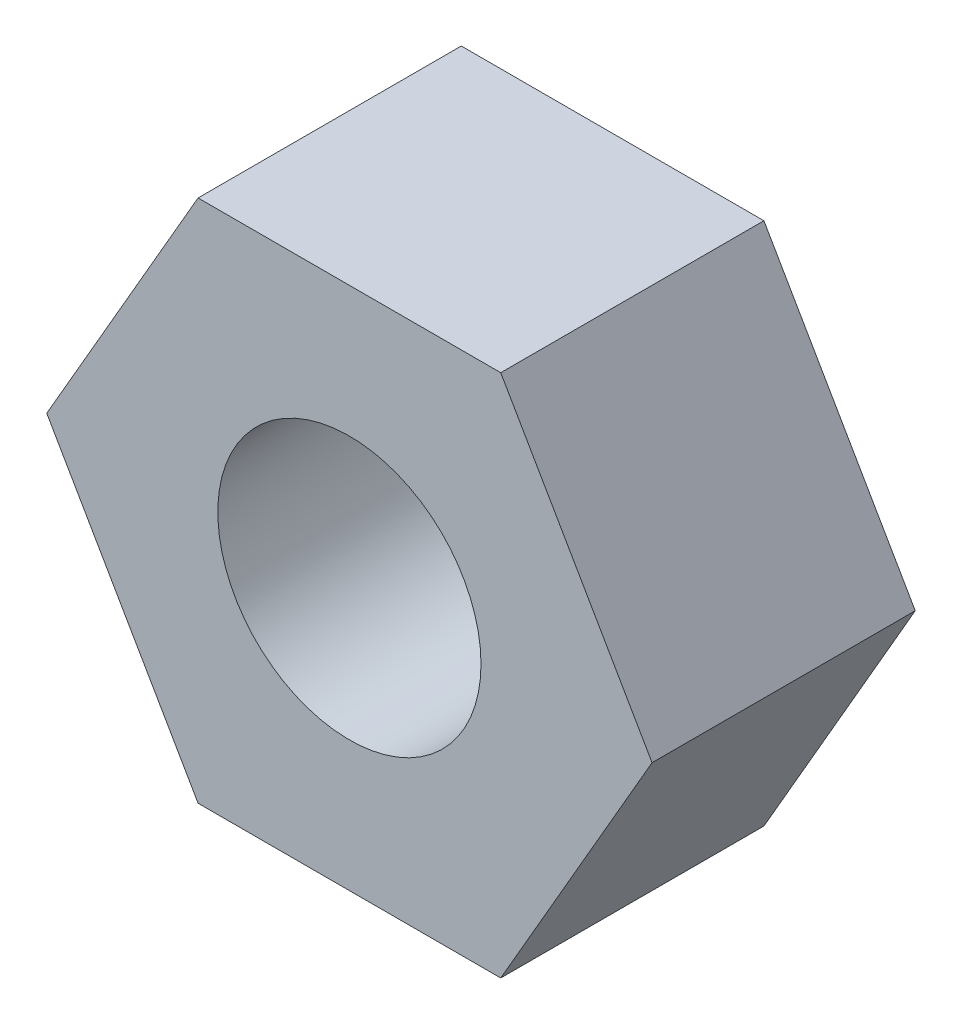
ISO-10303-21;
HEADER;
FILE_DESCRIPTION(('STEP AP214'),'2;1');
FILE_NAME('part.step','',(''),(''),'','','');
FILE_SCHEMA(('AUTOMOTIVE_DESIGN { 1 0 10303 214 1 1 1 1 }'));
ENDSEC;
DATA;
#1=APPLICATION_CONTEXT('core data for automotive mechanical design processes');
#2=APPLICATION_PROTOCOL_DEFINITION('international standard','automotive_design',2000,#1);
#3=PRODUCT_CONTEXT('',#1,'mechanical');
#4=PRODUCT('Part','Part','',(#3));
#5=PRODUCT_RELATED_PRODUCT_CATEGORY('part','',(#4));
#6=PRODUCT_DEFINITION_FORMATION('','',#4);
#7=PRODUCT_DEFINITION_CONTEXT('part definition',#1,'design');
#8=PRODUCT_DEFINITION('design','',#6,#7);
#9=PRODUCT_DEFINITION_SHAPE('','',#8);
#10=(LENGTH_UNIT() NAMED_UNIT(*) SI_UNIT(.MILLI.,.METRE.));
#11=(NAMED_UNIT(*) PLANE_ANGLE_UNIT() SI_UNIT($,.RADIAN.));
#12=(NAMED_UNIT(*) SI_UNIT($,.STERADIAN.) SOLID_ANGLE_UNIT());
#13=UNCERTAINTY_MEASURE_WITH_UNIT(LENGTH_MEASURE(1.E-05),#10,'distance_accuracy_value','');
#14=(GEOMETRIC_REPRESENTATION_CONTEXT(3) GLOBAL_UNCERTAINTY_ASSIGNED_CONTEXT((#13)) GLOBAL_UNIT_ASSIGNED_CONTEXT((#10,
#11,#12)) REPRESENTATION_CONTEXT('',''));
#15=CARTESIAN_POINT('',(0.,0.,0.));
#16=DIRECTION('',(0.,0.,1.));
#17=DIRECTION('',(1.,0.,0.));
#18=AXIS2_PLACEMENT_3D('',#15,#16,#17);
#19=CARTESIAN_POINT('',(11.5,0.,10.));
#20=DIRECTION('',(-0.866025403784438,-0.5,0.));
#21=DIRECTION('',(0.5,-0.866025403784439,0.));
#22=AXIS2_PLACEMENT_3D('',#19,#20,#21);
#23=PLANE('',#22);
#24=DIRECTION('',(-0.5,0.866025403784438,0.));
#25=VECTOR('',#24,1.);
#26=CARTESIAN_POINT('',(11.5,0.,0.));
#27=LINE('',#26,#25);
#28=CARTESIAN_POINT('',(11.5,0.,0.));
#29=VERTEX_POINT('',#28);
#30=CARTESIAN_POINT('',(5.75,9.95929214352105,0.));
#31=VERTEX_POINT('',#30);
#32=EDGE_CURVE('E134',#29,#31,#27,.T.);
#33=ORIENTED_EDGE('',*,*,#32,.T.);
#34=DIRECTION('',(0.,0.,-1.));
#35=VECTOR('',#34,1.);
#36=CARTESIAN_POINT('',(5.75,9.95929214352105,10.));
#37=LINE('',#36,#35);
#38=CARTESIAN_POINT('',(5.75,9.95929214352105,10.));
#39=VERTEX_POINT('',#38);
#40=EDGE_CURVE('E11',#39,#31,#37,.T.);
#41=ORIENTED_EDGE('',*,*,#40,.F.);
#42=DIRECTION('',(-0.5,0.866025403784438,0.));
#43=VECTOR('',#42,1.);
#44=CARTESIAN_POINT('',(11.5,0.,10.));
#45=LINE('',#44,#43);
#46=CARTESIAN_POINT('',(11.5,0.,10.));
#47=VERTEX_POINT('',#46);
#48=EDGE_CURVE('E151',#47,#39,#45,.T.);
#49=ORIENTED_EDGE('',*,*,#48,.F.);
#50=DIRECTION('',(0.,0.,-1.));
#51=VECTOR('',#50,1.);
#52=CARTESIAN_POINT('',(11.5,0.,10.));
#53=LINE('',#52,#51);
#54=EDGE_CURVE('E130',#47,#29,#53,.T.);
#55=ORIENTED_EDGE('',*,*,#54,.T.);
#56=EDGE_LOOP('',(#33,#41,#49,#55));
#57=FACE_BOUND('',#56,.T.);
#58=ADVANCED_FACE('F45',(#57),#23,.F.);
#59=CARTESIAN_POINT('',(5.75,9.95929214352105,10.));
#60=DIRECTION('',(0.,-1.,0.));
#61=DIRECTION('',(0.,0.,-1.));
#62=AXIS2_PLACEMENT_3D('',#59,#60,#61);
#63=PLANE('',#62);
#64=DIRECTION('',(-1.,0.,0.));
#65=VECTOR('',#64,1.);
#66=CARTESIAN_POINT('',(5.75,9.95929214352105,0.));
#67=LINE('',#66,#65);
#68=CARTESIAN_POINT('',(-5.75,9.95929214352105,0.));
#69=VERTEX_POINT('',#68);
#70=EDGE_CURVE('E138',#31,#69,#67,.T.);
#71=ORIENTED_EDGE('',*,*,#70,.T.);
#72=DIRECTION('',(0.,0.,-1.));
#73=VECTOR('',#72,1.);
#74=CARTESIAN_POINT('',(-5.75,9.95929214352105,10.));
#75=LINE('',#74,#73);
#76=CARTESIAN_POINT('',(-5.75,9.95929214352105,10.));
#77=VERTEX_POINT('',#76);
#78=EDGE_CURVE('E54',#77,#69,#75,.T.);
#79=ORIENTED_EDGE('',*,*,#78,.F.);
#80=DIRECTION('',(-1.,0.,0.));
#81=VECTOR('',#80,1.);
#82=CARTESIAN_POINT('',(5.75,9.95929214352105,10.));
#83=LINE('',#82,#81);
#84=EDGE_CURVE('E99',#39,#77,#83,.T.);
#85=ORIENTED_EDGE('',*,*,#84,.F.);
#86=ORIENTED_EDGE('',*,*,#40,.T.);
#87=EDGE_LOOP('',(#71,#79,#85,#86));
#88=FACE_BOUND('',#87,.T.);
#89=ADVANCED_FACE('F180',(#88),#63,.F.);
#90=CARTESIAN_POINT('',(-5.75,9.95929214352105,10.));
#91=DIRECTION('',(0.866025403784439,-0.5,0.));
#92=DIRECTION('',(0.5,0.866025403784439,0.));
#93=AXIS2_PLACEMENT_3D('',#90,#91,#92);
#94=PLANE('',#93);
#95=DIRECTION('',(-0.5,-0.866025403784439,0.));
#96=VECTOR('',#95,1.);
#97=CARTESIAN_POINT('',(-5.75,9.95929214352105,0.));
#98=LINE('',#97,#96);
#99=CARTESIAN_POINT('',(-11.5,0.,0.));
#100=VERTEX_POINT('',#99);
#101=EDGE_CURVE('E142',#69,#100,#98,.T.);
#102=ORIENTED_EDGE('',*,*,#101,.T.);
#103=DIRECTION('',(0.,0.,-1.));
#104=VECTOR('',#103,1.);
#105=CARTESIAN_POINT('',(-11.5,0.,10.));
#106=LINE('',#105,#104);
#107=CARTESIAN_POINT('',(-11.5,0.,10.));
#108=VERTEX_POINT('',#107);
#109=EDGE_CURVE('E123',#108,#100,#106,.T.);
#110=ORIENTED_EDGE('',*,*,#109,.F.);
#111=DIRECTION('',(-0.5,-0.866025403784439,0.));
#112=VECTOR('',#111,1.);
#113=CARTESIAN_POINT('',(-5.75,9.95929214352105,10.));
#114=LINE('',#113,#112);
#115=EDGE_CURVE('E112',#77,#108,#114,.T.);
#116=ORIENTED_EDGE('',*,*,#115,.F.);
#117=ORIENTED_EDGE('',*,*,#78,.T.);
#118=EDGE_LOOP('',(#102,#110,#116,#117));
#119=FACE_BOUND('',#118,.T.);
#120=ADVANCED_FACE('F161',(#119),#94,.F.);
#121=CARTESIAN_POINT('',(-11.5,0.,10.));
#122=DIRECTION('',(0.866025403784438,0.5,0.));
#123=DIRECTION('',(-0.5,0.866025403784438,0.));
#124=AXIS2_PLACEMENT_3D('',#121,#122,#123);
#125=PLANE('',#124);
#126=DIRECTION('',(0.5,-0.866025403784438,0.));
#127=VECTOR('',#126,1.);
#128=CARTESIAN_POINT('',(-11.5,0.,0.));
#129=LINE('',#128,#127);
#130=CARTESIAN_POINT('',(-5.75,-9.95929214352105,0.));
#131=VERTEX_POINT('',#130);
#132=EDGE_CURVE('E121',#100,#131,#129,.T.);
#133=ORIENTED_EDGE('',*,*,#132,.T.);
#134=DIRECTION('',(0.,0.,-1.));
#135=VECTOR('',#134,1.);
#136=CARTESIAN_POINT('',(-5.75,-9.95929214352105,10.));
#137=LINE('',#136,#135);
#138=CARTESIAN_POINT('',(-5.75,-9.95929214352105,10.));
#139=VERTEX_POINT('',#138);
#140=EDGE_CURVE('E118',#139,#131,#137,.T.);
#141=ORIENTED_EDGE('',*,*,#140,.F.);
#142=DIRECTION('',(0.5,-0.866025403784438,0.));
#143=VECTOR('',#142,1.);
#144=CARTESIAN_POINT('',(-11.5,0.,10.));
#145=LINE('',#144,#143);
#146=EDGE_CURVE('E106',#108,#139,#145,.T.);
#147=ORIENTED_EDGE('',*,*,#146,.F.);
#148=ORIENTED_EDGE('',*,*,#109,.T.);
#149=EDGE_LOOP('',(#133,#141,#147,#148));
#150=FACE_BOUND('',#149,.T.);
#151=ADVANCED_FACE('F119',(#150),#125,.F.);
#152=CARTESIAN_POINT('',(-5.75,-9.95929214352105,10.));
#153=DIRECTION('',(0.,1.,0.));
#154=DIRECTION('',(-1.,0.,0.));
#155=AXIS2_PLACEMENT_3D('',#152,#153,#154);
#156=PLANE('',#155);
#157=DIRECTION('',(1.,0.,0.));
#158=VECTOR('',#157,1.);
#159=CARTESIAN_POINT('',(-5.75,-9.95929214352105,0.));
#160=LINE('',#159,#158);
#161=CARTESIAN_POINT('',(5.75,-9.95929214352105,0.));
#162=VERTEX_POINT('',#161);
#163=EDGE_CURVE('E85',#131,#162,#160,.T.);
#164=ORIENTED_EDGE('',*,*,#163,.T.);
#165=DIRECTION('',(0.,0.,-1.));
#166=VECTOR('',#165,1.);
#167=CARTESIAN_POINT('',(5.75,-9.95929214352105,10.));
#168=LINE('',#167,#166);
#169=CARTESIAN_POINT('',(5.75,-9.95929214352105,10.));
#170=VERTEX_POINT('',#169);
#171=EDGE_CURVE('E124',#170,#162,#168,.T.);
#172=ORIENTED_EDGE('',*,*,#171,.F.);
#173=DIRECTION('',(1.,0.,0.));
#174=VECTOR('',#173,1.);
#175=CARTESIAN_POINT('',(-5.75,-9.95929214352105,10.));
#176=LINE('',#175,#174);
#177=EDGE_CURVE('E110',#139,#170,#176,.T.);
#178=ORIENTED_EDGE('',*,*,#177,.F.);
#179=ORIENTED_EDGE('',*,*,#140,.T.);
#180=EDGE_LOOP('',(#164,#172,#178,#179));
#181=FACE_BOUND('',#180,.T.);
#182=ADVANCED_FACE('F126',(#181),#156,.F.);
#183=CARTESIAN_POINT('',(5.75,-9.95929214352105,10.));
#184=DIRECTION('',(-0.866025403784439,0.5,0.));
#185=DIRECTION('',(-0.5,-0.866025403784439,0.));
#186=AXIS2_PLACEMENT_3D('',#183,#184,#185);
#187=PLANE('',#186);
#188=DIRECTION('',(0.5,0.866025403784439,0.));
#189=VECTOR('',#188,1.);
#190=CARTESIAN_POINT('',(5.75,-9.95929214352105,0.));
#191=LINE('',#190,#189);
#192=EDGE_CURVE('E91',#162,#29,#191,.T.);
#193=ORIENTED_EDGE('',*,*,#192,.T.);
#194=ORIENTED_EDGE('',*,*,#54,.F.);
#195=DIRECTION('',(0.5,0.866025403784439,0.));
#196=VECTOR('',#195,1.);
#197=CARTESIAN_POINT('',(5.75,-9.95929214352105,10.));
#198=LINE('',#197,#196);
#199=EDGE_CURVE('E62',#170,#47,#198,.T.);
#200=ORIENTED_EDGE('',*,*,#199,.F.);
#201=ORIENTED_EDGE('',*,*,#171,.T.);
#202=EDGE_LOOP('',(#193,#194,#200,#201));
#203=FACE_BOUND('',#202,.T.);
#204=ADVANCED_FACE('F168',(#203),#187,.F.);
#205=CARTESIAN_POINT('',(0.,0.,10.));
#206=DIRECTION('',(0.,0.,1.));
#207=DIRECTION('',(1.,0.,0.));
#208=AXIS2_PLACEMENT_3D('',#205,#206,#207);
#209=PLANE('',#208);
#210=CARTESIAN_POINT('',(0.,0.,10.));
#211=DIRECTION('',(0.,0.,1.));
#212=DIRECTION('',(1.,0.,0.));
#213=AXIS2_PLACEMENT_3D('',#210,#211,#212);
#214=CIRCLE('',#213,5.);
#215=CARTESIAN_POINT('',(5.,0.,10.));
#216=VERTEX_POINT('',#215);
#217=EDGE_CURVE('E236',#216,#216,#214,.T.);
#218=ORIENTED_EDGE('',*,*,#217,.F.);
#219=EDGE_LOOP('',(#218));
#220=FACE_BOUND('',#219,.T.);
#221=ORIENTED_EDGE('',*,*,#48,.T.);
#222=ORIENTED_EDGE('',*,*,#84,.T.);
#223=ORIENTED_EDGE('',*,*,#115,.T.);
#224=ORIENTED_EDGE('',*,*,#146,.T.);
#225=ORIENTED_EDGE('',*,*,#177,.T.);
#226=ORIENTED_EDGE('',*,*,#199,.T.);
#227=EDGE_LOOP('',(#221,#222,#223,#224,#225,#226));
#228=FACE_BOUND('',#227,.T.);
#229=ADVANCED_FACE('F108',(#220,#228),#209,.T.);
#230=CARTESIAN_POINT('',(0.,0.,0.));
#231=DIRECTION('',(0.,0.,1.));
#232=DIRECTION('',(1.,0.,0.));
#233=AXIS2_PLACEMENT_3D('',#230,#231,#232);
#234=PLANE('',#233);
#235=CARTESIAN_POINT('',(0.,0.,0.));
#236=DIRECTION('',(0.,0.,1.));
#237=DIRECTION('',(1.,0.,0.));
#238=AXIS2_PLACEMENT_3D('',#235,#236,#237);
#239=CIRCLE('',#238,5.);
#240=CARTESIAN_POINT('',(5.,0.,0.));
#241=VERTEX_POINT('',#240);
#242=EDGE_CURVE('E139',#241,#241,#239,.T.);
#243=ORIENTED_EDGE('',*,*,#242,.T.);
#244=EDGE_LOOP('',(#243));
#245=FACE_BOUND('',#244,.T.);
#246=ORIENTED_EDGE('',*,*,#32,.F.);
#247=ORIENTED_EDGE('',*,*,#192,.F.);
#248=ORIENTED_EDGE('',*,*,#163,.F.);
#249=ORIENTED_EDGE('',*,*,#132,.F.);
#250=ORIENTED_EDGE('',*,*,#101,.F.);
#251=ORIENTED_EDGE('',*,*,#70,.F.);
#252=EDGE_LOOP('',(#246,#247,#248,#249,#250,#251));
#253=FACE_BOUND('',#252,.T.);
#254=ADVANCED_FACE('F164',(#245,#253),#234,.F.);
#255=CARTESIAN_POINT('',(0.,0.,0.));
#256=DIRECTION('',(0.,0.,1.));
#257=DIRECTION('',(1.,0.,0.));
#258=AXIS2_PLACEMENT_3D('',#255,#256,#257);
#259=CYLINDRICAL_SURFACE('',#258,5.);
#260=ORIENTED_EDGE('',*,*,#242,.F.);
#261=EDGE_LOOP('',(#260));
#262=FACE_BOUND('',#261,.T.);
#263=ORIENTED_EDGE('',*,*,#217,.T.);
#264=EDGE_LOOP('',(#263));
#265=FACE_BOUND('',#264,.T.);
#266=ADVANCED_FACE('F219',(#262,#265),#259,.F.);
#267=CLOSED_SHELL('',(#58,#89,#120,#151,#182,#204,#229,#254,#266));
#268=MANIFOLD_SOLID_BREP('B2',#267);
#269=ADVANCED_BREP_SHAPE_REPRESENTATION('',(#18,#268),#14);
#270=SHAPE_DEFINITION_REPRESENTATION(#9,#269);
ENDSEC;
END-ISO-10303-21;
